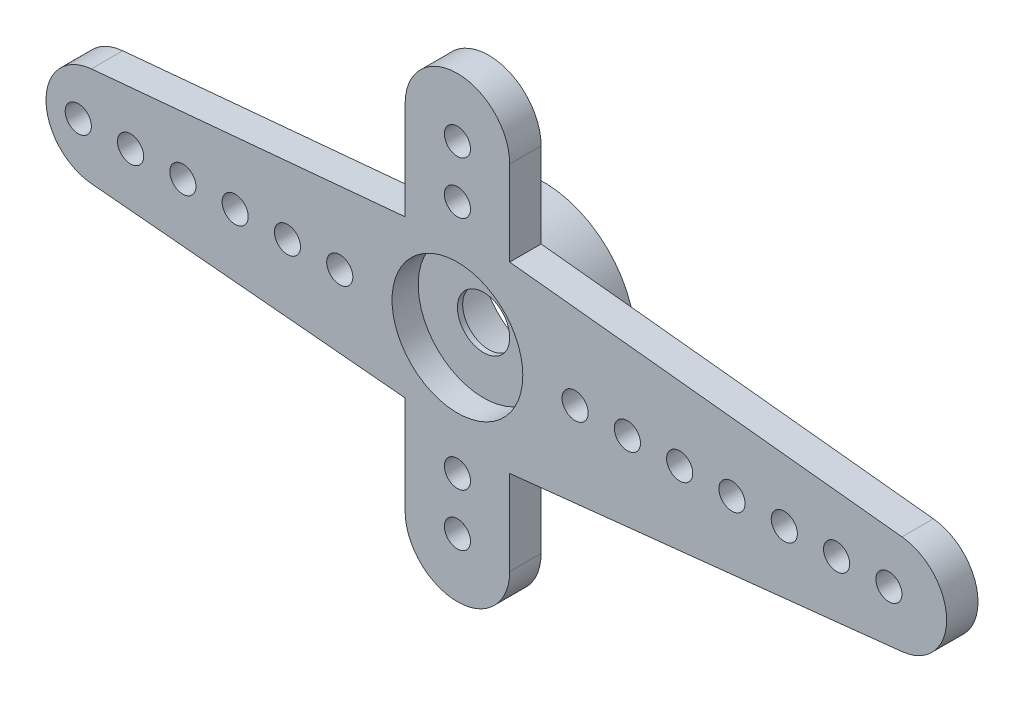
ISO-10303-21;
HEADER;
FILE_DESCRIPTION(('STEP AP214'),'2;1');
FILE_NAME('part.step','',(''),(''),'','','');
FILE_SCHEMA(('AUTOMOTIVE_DESIGN { 1 0 10303 214 1 1 1 1 }'));
ENDSEC;
DATA;
#1=APPLICATION_CONTEXT('core data for automotive mechanical design processes');
#2=APPLICATION_PROTOCOL_DEFINITION('international standard','automotive_design',2000,#1);
#3=PRODUCT_CONTEXT('',#1,'mechanical');
#4=PRODUCT('Part','Part','',(#3));
#5=PRODUCT_RELATED_PRODUCT_CATEGORY('part','',(#4));
#6=PRODUCT_DEFINITION_FORMATION('','',#4);
#7=PRODUCT_DEFINITION_CONTEXT('part definition',#1,'design');
#8=PRODUCT_DEFINITION('design','',#6,#7);
#9=PRODUCT_DEFINITION_SHAPE('','',#8);
#10=(LENGTH_UNIT() NAMED_UNIT(*) SI_UNIT(.MILLI.,.METRE.));
#11=(NAMED_UNIT(*) PLANE_ANGLE_UNIT() SI_UNIT($,.RADIAN.));
#12=(NAMED_UNIT(*) SI_UNIT($,.STERADIAN.) SOLID_ANGLE_UNIT());
#13=UNCERTAINTY_MEASURE_WITH_UNIT(LENGTH_MEASURE(1.E-05),#10,'distance_accuracy_value','');
#14=(GEOMETRIC_REPRESENTATION_CONTEXT(3) GLOBAL_UNCERTAINTY_ASSIGNED_CONTEXT((#13)) GLOBAL_UNIT_ASSIGNED_CONTEXT((#10,
#11,#12)) REPRESENTATION_CONTEXT('',''));
#15=CARTESIAN_POINT('',(0.,0.,0.));
#16=DIRECTION('',(0.,0.,1.));
#17=DIRECTION('',(1.,0.,0.));
#18=AXIS2_PLACEMENT_3D('',#15,#16,#17);
#19=CARTESIAN_POINT('',(0.,0.,-2.1));
#20=DIRECTION('',(0.,0.,1.));
#21=DIRECTION('',(1.,0.,0.));
#22=AXIS2_PLACEMENT_3D('',#19,#20,#21);
#23=CYLINDRICAL_SURFACE('',#22,1.);
#24=CARTESIAN_POINT('',(0.,0.,0.2));
#25=DIRECTION('',(0.,0.,1.));
#26=DIRECTION('',(1.,0.,0.));
#27=AXIS2_PLACEMENT_3D('',#24,#25,#26);
#28=CIRCLE('',#27,1.);
#29=CARTESIAN_POINT('',(1.,0.,0.2));
#30=VERTEX_POINT('',#29);
#31=EDGE_CURVE('E212',#30,#30,#28,.T.);
#32=ORIENTED_EDGE('',*,*,#31,.T.);
#33=EDGE_LOOP('',(#32));
#34=FACE_BOUND('',#33,.T.);
#35=CARTESIAN_POINT('',(0.,0.,0.));
#36=DIRECTION('',(0.,0.,-1.));
#37=DIRECTION('',(-1.,0.,0.));
#38=AXIS2_PLACEMENT_3D('',#35,#36,#37);
#39=CIRCLE('',#38,1.);
#40=CARTESIAN_POINT('',(-1.,0.,0.));
#41=VERTEX_POINT('',#40);
#42=EDGE_CURVE('E209',#41,#41,#39,.F.);
#43=ORIENTED_EDGE('',*,*,#42,.F.);
#44=EDGE_LOOP('',(#43));
#45=FACE_BOUND('',#44,.T.);
#46=ADVANCED_FACE('F36',(#34,#45),#23,.F.);
#47=CARTESIAN_POINT('',(0.,6.75,1.2));
#48=DIRECTION('',(0.,0.,-1.));
#49=DIRECTION('',(-1.,0.,0.));
#50=AXIS2_PLACEMENT_3D('',#47,#48,#49);
#51=CYLINDRICAL_SURFACE('',#50,2.);
#52=CARTESIAN_POINT('',(0.,6.75,0.));
#53=DIRECTION('',(0.,0.,1.));
#54=DIRECTION('',(-1.,0.,0.));
#55=AXIS2_PLACEMENT_3D('',#52,#53,#54);
#56=CIRCLE('',#55,2.);
#57=CARTESIAN_POINT('',(2.,6.75,0.));
#58=VERTEX_POINT('',#57);
#59=CARTESIAN_POINT('',(-2.,6.75,0.));
#60=VERTEX_POINT('',#59);
#61=EDGE_CURVE('E160',#58,#60,#56,.T.);
#62=ORIENTED_EDGE('',*,*,#61,.T.);
#63=DIRECTION('',(0.,0.,-1.));
#64=VECTOR('',#63,1.);
#65=CARTESIAN_POINT('',(-2.,6.75,1.2));
#66=LINE('',#65,#64);
#67=CARTESIAN_POINT('',(-2.,6.75,1.2));
#68=VERTEX_POINT('',#67);
#69=EDGE_CURVE('E46',#68,#60,#66,.T.);
#70=ORIENTED_EDGE('',*,*,#69,.F.);
#71=CARTESIAN_POINT('',(0.,6.75,1.2));
#72=DIRECTION('',(0.,0.,1.));
#73=DIRECTION('',(-1.,0.,0.));
#74=AXIS2_PLACEMENT_3D('',#71,#72,#73);
#75=CIRCLE('',#74,2.);
#76=CARTESIAN_POINT('',(2.,6.75,1.2));
#77=VERTEX_POINT('',#76);
#78=EDGE_CURVE('E183',#77,#68,#75,.T.);
#79=ORIENTED_EDGE('',*,*,#78,.F.);
#80=DIRECTION('',(0.,0.,-1.));
#81=VECTOR('',#80,1.);
#82=CARTESIAN_POINT('',(2.,6.75,1.2));
#83=LINE('',#82,#81);
#84=EDGE_CURVE('E156',#77,#58,#83,.T.);
#85=ORIENTED_EDGE('',*,*,#84,.T.);
#86=EDGE_LOOP('',(#62,#70,#79,#85));
#87=FACE_BOUND('',#86,.T.);
#88=ADVANCED_FACE('F38',(#87),#51,.T.);
#89=CARTESIAN_POINT('',(-2.,3.,1.2));
#90=DIRECTION('',(1.,0.,0.));
#91=DIRECTION('',(0.,0.,-1.));
#92=AXIS2_PLACEMENT_3D('',#89,#90,#91);
#93=PLANE('',#92);
#94=DIRECTION('',(0.,-1.,0.));
#95=VECTOR('',#94,1.);
#96=CARTESIAN_POINT('',(-2.,3.,0.));
#97=LINE('',#96,#95);
#98=CARTESIAN_POINT('',(-2.,3.,0.));
#99=VERTEX_POINT('',#98);
#100=EDGE_CURVE('E163',#60,#99,#97,.T.);
#101=ORIENTED_EDGE('',*,*,#100,.T.);
#102=DIRECTION('',(0.,0.,-1.));
#103=VECTOR('',#102,1.);
#104=CARTESIAN_POINT('',(-2.,3.,1.2));
#105=LINE('',#104,#103);
#106=CARTESIAN_POINT('',(-2.,3.,1.2));
#107=VERTEX_POINT('',#106);
#108=EDGE_CURVE('E205',#107,#99,#105,.T.);
#109=ORIENTED_EDGE('',*,*,#108,.F.);
#110=DIRECTION('',(0.,-1.,0.));
#111=VECTOR('',#110,1.);
#112=CARTESIAN_POINT('',(-2.,3.,1.2));
#113=LINE('',#112,#111);
#114=EDGE_CURVE('E111',#68,#107,#113,.T.);
#115=ORIENTED_EDGE('',*,*,#114,.F.);
#116=ORIENTED_EDGE('',*,*,#69,.T.);
#117=EDGE_LOOP('',(#101,#109,#115,#116));
#118=FACE_BOUND('',#117,.T.);
#119=ADVANCED_FACE('F342',(#118),#93,.F.);
#120=CARTESIAN_POINT('',(-14.,1.9,1.2));
#121=DIRECTION('',(0.0912839495849539,-0.995824904563132,0.));
#122=DIRECTION('',(0.995824904563132,0.0912839495849539,0.));
#123=AXIS2_PLACEMENT_3D('',#120,#121,#122);
#124=PLANE('',#123);
#125=DIRECTION('',(-0.995824904563132,-0.0912839495849539,0.));
#126=VECTOR('',#125,1.);
#127=CARTESIAN_POINT('',(-14.,1.9,0.));
#128=LINE('',#127,#126);
#129=CARTESIAN_POINT('',(-14.,1.9,0.));
#130=VERTEX_POINT('',#129);
#131=EDGE_CURVE('E166',#99,#130,#128,.T.);
#132=ORIENTED_EDGE('',*,*,#131,.T.);
#133=DIRECTION('',(0.,0.,-1.));
#134=VECTOR('',#133,1.);
#135=CARTESIAN_POINT('',(-14.,1.9,1.2));
#136=LINE('',#135,#134);
#137=CARTESIAN_POINT('',(-14.,1.9,1.2));
#138=VERTEX_POINT('',#137);
#139=EDGE_CURVE('E202',#138,#130,#136,.T.);
#140=ORIENTED_EDGE('',*,*,#139,.F.);
#141=DIRECTION('',(-0.995824904563132,-0.0912839495849539,0.));
#142=VECTOR('',#141,1.);
#143=CARTESIAN_POINT('',(-14.,1.9,1.2));
#144=LINE('',#143,#142);
#145=EDGE_CURVE('E297',#107,#138,#144,.T.);
#146=ORIENTED_EDGE('',*,*,#145,.F.);
#147=ORIENTED_EDGE('',*,*,#108,.T.);
#148=EDGE_LOOP('',(#132,#140,#146,#147));
#149=FACE_BOUND('',#148,.T.);
#150=ADVANCED_FACE('F791',(#149),#124,.F.);
#151=CARTESIAN_POINT('',(-13.8258333333333,0.,1.2));
#152=DIRECTION('',(0.,0.,-1.));
#153=DIRECTION('',(-1.,0.,0.));
#154=AXIS2_PLACEMENT_3D('',#151,#152,#153);
#155=CYLINDRICAL_SURFACE('',#154,1.90796593988933);
#156=CARTESIAN_POINT('',(-13.8258333333333,0.,0.));
#157=DIRECTION('',(0.,0.,1.));
#158=DIRECTION('',(1.,0.,0.));
#159=AXIS2_PLACEMENT_3D('',#156,#157,#158);
#160=CIRCLE('',#159,1.90796593988933);
#161=CARTESIAN_POINT('',(-14.,-1.9,0.));
#162=VERTEX_POINT('',#161);
#163=EDGE_CURVE('E168',#130,#162,#160,.T.);
#164=ORIENTED_EDGE('',*,*,#163,.T.);
#165=DIRECTION('',(0.,0.,-1.));
#166=VECTOR('',#165,1.);
#167=CARTESIAN_POINT('',(-14.,-1.9,1.2));
#168=LINE('',#167,#166);
#169=CARTESIAN_POINT('',(-14.,-1.9,1.2));
#170=VERTEX_POINT('',#169);
#171=EDGE_CURVE('E199',#170,#162,#168,.T.);
#172=ORIENTED_EDGE('',*,*,#171,.F.);
#173=CARTESIAN_POINT('',(-13.8258333333333,0.,1.2));
#174=DIRECTION('',(0.,0.,1.));
#175=DIRECTION('',(1.,0.,0.));
#176=AXIS2_PLACEMENT_3D('',#173,#174,#175);
#177=CIRCLE('',#176,1.90796593988933);
#178=EDGE_CURVE('E299',#138,#170,#177,.T.);
#179=ORIENTED_EDGE('',*,*,#178,.F.);
#180=ORIENTED_EDGE('',*,*,#139,.T.);
#181=EDGE_LOOP('',(#164,#172,#179,#180));
#182=FACE_BOUND('',#181,.T.);
#183=ADVANCED_FACE('F781',(#182),#155,.T.);
#184=CARTESIAN_POINT('',(-14.,-1.9,1.2));
#185=DIRECTION('',(0.0912839495849537,0.995824904563132,0.));
#186=DIRECTION('',(-0.995824904563133,0.0912839495849537,0.));
#187=AXIS2_PLACEMENT_3D('',#184,#185,#186);
#188=PLANE('',#187);
#189=DIRECTION('',(0.995824904563132,-0.0912839495849537,0.));
#190=VECTOR('',#189,1.);
#191=CARTESIAN_POINT('',(-14.,-1.9,0.));
#192=LINE('',#191,#190);
#193=CARTESIAN_POINT('',(-2.,-3.,0.));
#194=VERTEX_POINT('',#193);
#195=EDGE_CURVE('E170',#162,#194,#192,.T.);
#196=ORIENTED_EDGE('',*,*,#195,.T.);
#197=DIRECTION('',(0.,0.,-1.));
#198=VECTOR('',#197,1.);
#199=CARTESIAN_POINT('',(-2.,-3.,1.2));
#200=LINE('',#199,#198);
#201=CARTESIAN_POINT('',(-2.,-3.,1.2));
#202=VERTEX_POINT('',#201);
#203=EDGE_CURVE('E196',#202,#194,#200,.T.);
#204=ORIENTED_EDGE('',*,*,#203,.F.);
#205=DIRECTION('',(0.995824904563132,-0.0912839495849537,0.));
#206=VECTOR('',#205,1.);
#207=CARTESIAN_POINT('',(-14.,-1.9,1.2));
#208=LINE('',#207,#206);
#209=EDGE_CURVE('E301',#170,#202,#208,.T.);
#210=ORIENTED_EDGE('',*,*,#209,.F.);
#211=ORIENTED_EDGE('',*,*,#171,.T.);
#212=EDGE_LOOP('',(#196,#204,#210,#211));
#213=FACE_BOUND('',#212,.T.);
#214=ADVANCED_FACE('F771',(#213),#188,.F.);
#215=CARTESIAN_POINT('',(-2.,-6.75,1.2));
#216=DIRECTION('',(1.,0.,0.));
#217=DIRECTION('',(0.,0.,-1.));
#218=AXIS2_PLACEMENT_3D('',#215,#216,#217);
#219=PLANE('',#218);
#220=DIRECTION('',(0.,-1.,0.));
#221=VECTOR('',#220,1.);
#222=CARTESIAN_POINT('',(-2.,-6.75,0.));
#223=LINE('',#222,#221);
#224=CARTESIAN_POINT('',(-2.,-6.75,0.));
#225=VERTEX_POINT('',#224);
#226=EDGE_CURVE('E172',#194,#225,#223,.T.);
#227=ORIENTED_EDGE('',*,*,#226,.T.);
#228=DIRECTION('',(0.,0.,-1.));
#229=VECTOR('',#228,1.);
#230=CARTESIAN_POINT('',(-2.,-6.75,1.2));
#231=LINE('',#230,#229);
#232=CARTESIAN_POINT('',(-2.,-6.75,1.2));
#233=VERTEX_POINT('',#232);
#234=EDGE_CURVE('E193',#233,#225,#231,.T.);
#235=ORIENTED_EDGE('',*,*,#234,.F.);
#236=DIRECTION('',(0.,-1.,0.));
#237=VECTOR('',#236,1.);
#238=CARTESIAN_POINT('',(-2.,-6.75,1.2));
#239=LINE('',#238,#237);
#240=EDGE_CURVE('E303',#202,#233,#239,.T.);
#241=ORIENTED_EDGE('',*,*,#240,.F.);
#242=ORIENTED_EDGE('',*,*,#203,.T.);
#243=EDGE_LOOP('',(#227,#235,#241,#242));
#244=FACE_BOUND('',#243,.T.);
#245=ADVANCED_FACE('F761',(#244),#219,.F.);
#246=CARTESIAN_POINT('',(0.,-6.75,1.2));
#247=DIRECTION('',(0.,0.,-1.));
#248=DIRECTION('',(-1.,0.,0.));
#249=AXIS2_PLACEMENT_3D('',#246,#247,#248);
#250=CYLINDRICAL_SURFACE('',#249,2.);
#251=CARTESIAN_POINT('',(0.,-6.75,0.));
#252=DIRECTION('',(0.,0.,1.));
#253=DIRECTION('',(-1.,0.,0.));
#254=AXIS2_PLACEMENT_3D('',#251,#252,#253);
#255=CIRCLE('',#254,2.);
#256=CARTESIAN_POINT('',(2.,-6.75,0.));
#257=VERTEX_POINT('',#256);
#258=EDGE_CURVE('E174',#225,#257,#255,.T.);
#259=ORIENTED_EDGE('',*,*,#258,.T.);
#260=DIRECTION('',(0.,0.,-1.));
#261=VECTOR('',#260,1.);
#262=CARTESIAN_POINT('',(2.,-6.75,1.2));
#263=LINE('',#262,#261);
#264=CARTESIAN_POINT('',(2.,-6.75,1.2));
#265=VERTEX_POINT('',#264);
#266=EDGE_CURVE('E190',#265,#257,#263,.T.);
#267=ORIENTED_EDGE('',*,*,#266,.F.);
#268=CARTESIAN_POINT('',(0.,-6.75,1.2));
#269=DIRECTION('',(0.,0.,1.));
#270=DIRECTION('',(-1.,0.,0.));
#271=AXIS2_PLACEMENT_3D('',#268,#269,#270);
#272=CIRCLE('',#271,2.);
#273=EDGE_CURVE('E305',#233,#265,#272,.T.);
#274=ORIENTED_EDGE('',*,*,#273,.F.);
#275=ORIENTED_EDGE('',*,*,#234,.T.);
#276=EDGE_LOOP('',(#259,#267,#274,#275));
#277=FACE_BOUND('',#276,.T.);
#278=ADVANCED_FACE('F752',(#277),#250,.T.);
#279=CARTESIAN_POINT('',(2.,-6.75,1.2));
#280=DIRECTION('',(-1.,0.,0.));
#281=DIRECTION('',(0.,0.,1.));
#282=AXIS2_PLACEMENT_3D('',#279,#280,#281);
#283=PLANE('',#282);
#284=DIRECTION('',(0.,1.,0.));
#285=VECTOR('',#284,1.);
#286=CARTESIAN_POINT('',(2.,-6.75,0.));
#287=LINE('',#286,#285);
#288=CARTESIAN_POINT('',(2.,-3.5,0.));
#289=VERTEX_POINT('',#288);
#290=EDGE_CURVE('E176',#257,#289,#287,.T.);
#291=ORIENTED_EDGE('',*,*,#290,.T.);
#292=DIRECTION('',(0.,0.,-1.));
#293=VECTOR('',#292,1.);
#294=CARTESIAN_POINT('',(2.,-3.5,1.2));
#295=LINE('',#294,#293);
#296=CARTESIAN_POINT('',(2.,-3.5,1.2));
#297=VERTEX_POINT('',#296);
#298=EDGE_CURVE('E187',#297,#289,#295,.T.);
#299=ORIENTED_EDGE('',*,*,#298,.F.);
#300=DIRECTION('',(0.,1.,0.));
#301=VECTOR('',#300,1.);
#302=CARTESIAN_POINT('',(2.,-6.75,1.2));
#303=LINE('',#302,#301);
#304=EDGE_CURVE('E307',#265,#297,#303,.T.);
#305=ORIENTED_EDGE('',*,*,#304,.F.);
#306=ORIENTED_EDGE('',*,*,#266,.T.);
#307=EDGE_LOOP('',(#291,#299,#305,#306));
#308=FACE_BOUND('',#307,.T.);
#309=ADVANCED_FACE('F313',(#308),#283,.F.);
#310=CARTESIAN_POINT('',(17.,-1.9,1.2));
#311=DIRECTION('',(-0.106064981392206,0.994359200551929,0.));
#312=DIRECTION('',(-0.994359200551929,-0.106064981392206,0.));
#313=AXIS2_PLACEMENT_3D('',#310,#311,#312);
#314=PLANE('',#313);
#315=DIRECTION('',(0.994359200551929,0.106064981392206,0.));
#316=VECTOR('',#315,1.);
#317=CARTESIAN_POINT('',(17.,-1.9,0.));
#318=LINE('',#317,#316);
#319=CARTESIAN_POINT('',(17.,-1.9,0.));
#320=VERTEX_POINT('',#319);
#321=EDGE_CURVE('E178',#289,#320,#318,.T.);
#322=ORIENTED_EDGE('',*,*,#321,.T.);
#323=DIRECTION('',(0.,0.,-1.));
#324=VECTOR('',#323,1.);
#325=CARTESIAN_POINT('',(17.,-1.9,1.2));
#326=LINE('',#325,#324);
#327=CARTESIAN_POINT('',(17.,-1.9,1.2));
#328=VERTEX_POINT('',#327);
#329=EDGE_CURVE('E151',#328,#320,#326,.T.);
#330=ORIENTED_EDGE('',*,*,#329,.F.);
#331=DIRECTION('',(0.994359200551929,0.106064981392206,0.));
#332=VECTOR('',#331,1.);
#333=CARTESIAN_POINT('',(17.,-1.9,1.2));
#334=LINE('',#333,#332);
#335=EDGE_CURVE('E142',#297,#328,#334,.T.);
#336=ORIENTED_EDGE('',*,*,#335,.F.);
#337=ORIENTED_EDGE('',*,*,#298,.T.);
#338=EDGE_LOOP('',(#322,#330,#336,#337));
#339=FACE_BOUND('',#338,.T.);
#340=ADVANCED_FACE('F317',(#339),#314,.F.);
#341=CARTESIAN_POINT('',(16.7973333333333,0.,1.2));
#342=DIRECTION('',(0.,0.,-1.));
#343=DIRECTION('',(-1.,0.,0.));
#344=AXIS2_PLACEMENT_3D('',#341,#342,#343);
#345=CYLINDRICAL_SURFACE('',#344,1.91077831727749);
#346=CARTESIAN_POINT('',(16.7973333333333,0.,0.));
#347=DIRECTION('',(0.,0.,1.));
#348=DIRECTION('',(1.,0.,0.));
#349=AXIS2_PLACEMENT_3D('',#346,#347,#348);
#350=CIRCLE('',#349,1.91077831727749);
#351=CARTESIAN_POINT('',(17.,1.9,0.));
#352=VERTEX_POINT('',#351);
#353=EDGE_CURVE('E150',#320,#352,#350,.T.);
#354=ORIENTED_EDGE('',*,*,#353,.T.);
#355=DIRECTION('',(0.,0.,-1.));
#356=VECTOR('',#355,1.);
#357=CARTESIAN_POINT('',(17.,1.9,1.2));
#358=LINE('',#357,#356);
#359=CARTESIAN_POINT('',(17.,1.9,1.2));
#360=VERTEX_POINT('',#359);
#361=EDGE_CURVE('E147',#360,#352,#358,.T.);
#362=ORIENTED_EDGE('',*,*,#361,.F.);
#363=CARTESIAN_POINT('',(16.7973333333333,0.,1.2));
#364=DIRECTION('',(0.,0.,1.));
#365=DIRECTION('',(1.,0.,0.));
#366=AXIS2_PLACEMENT_3D('',#363,#364,#365);
#367=CIRCLE('',#366,1.91077831727749);
#368=EDGE_CURVE('E136',#328,#360,#367,.T.);
#369=ORIENTED_EDGE('',*,*,#368,.F.);
#370=ORIENTED_EDGE('',*,*,#329,.T.);
#371=EDGE_LOOP('',(#354,#362,#369,#370));
#372=FACE_BOUND('',#371,.T.);
#373=ADVANCED_FACE('F148',(#372),#345,.T.);
#374=CARTESIAN_POINT('',(2.,3.5,1.2));
#375=DIRECTION('',(-0.106064981392206,-0.994359200551929,0.));
#376=DIRECTION('',(0.994359200551929,-0.106064981392206,0.));
#377=AXIS2_PLACEMENT_3D('',#374,#375,#376);
#378=PLANE('',#377);
#379=DIRECTION('',(-0.994359200551929,0.106064981392206,0.));
#380=VECTOR('',#379,1.);
#381=CARTESIAN_POINT('',(2.,3.5,0.));
#382=LINE('',#381,#380);
#383=CARTESIAN_POINT('',(2.,3.5,0.));
#384=VERTEX_POINT('',#383);
#385=EDGE_CURVE('E96',#352,#384,#382,.T.);
#386=ORIENTED_EDGE('',*,*,#385,.T.);
#387=DIRECTION('',(0.,0.,-1.));
#388=VECTOR('',#387,1.);
#389=CARTESIAN_POINT('',(2.,3.5,1.2));
#390=LINE('',#389,#388);
#391=CARTESIAN_POINT('',(2.,3.5,1.2));
#392=VERTEX_POINT('',#391);
#393=EDGE_CURVE('E152',#392,#384,#390,.T.);
#394=ORIENTED_EDGE('',*,*,#393,.F.);
#395=DIRECTION('',(-0.994359200551929,0.106064981392206,0.));
#396=VECTOR('',#395,1.);
#397=CARTESIAN_POINT('',(2.,3.5,1.2));
#398=LINE('',#397,#396);
#399=EDGE_CURVE('E140',#360,#392,#398,.T.);
#400=ORIENTED_EDGE('',*,*,#399,.F.);
#401=ORIENTED_EDGE('',*,*,#361,.T.);
#402=EDGE_LOOP('',(#386,#394,#400,#401));
#403=FACE_BOUND('',#402,.T.);
#404=ADVANCED_FACE('F154',(#403),#378,.F.);
#405=CARTESIAN_POINT('',(2.,3.5,1.2));
#406=DIRECTION('',(-1.,0.,0.));
#407=DIRECTION('',(0.,0.,1.));
#408=AXIS2_PLACEMENT_3D('',#405,#406,#407);
#409=PLANE('',#408);
#410=DIRECTION('',(0.,1.,0.));
#411=VECTOR('',#410,1.);
#412=CARTESIAN_POINT('',(2.,3.5,0.));
#413=LINE('',#412,#411);
#414=EDGE_CURVE('E102',#384,#58,#413,.T.);
#415=ORIENTED_EDGE('',*,*,#414,.T.);
#416=ORIENTED_EDGE('',*,*,#84,.F.);
#417=DIRECTION('',(0.,1.,0.));
#418=VECTOR('',#417,1.);
#419=CARTESIAN_POINT('',(2.,3.5,1.2));
#420=LINE('',#419,#418);
#421=EDGE_CURVE('E55',#392,#77,#420,.T.);
#422=ORIENTED_EDGE('',*,*,#421,.F.);
#423=ORIENTED_EDGE('',*,*,#393,.T.);
#424=EDGE_LOOP('',(#415,#416,#422,#423));
#425=FACE_BOUND('',#424,.T.);
#426=ADVANCED_FACE('F325',(#425),#409,.F.);
#427=CARTESIAN_POINT('',(0.,6.75,1.2));
#428=DIRECTION('',(0.,0.,-1.));
#429=DIRECTION('',(-1.,0.,0.));
#430=AXIS2_PLACEMENT_3D('',#427,#428,#429);
#431=PLANE('',#430);
#432=CARTESIAN_POINT('',(16.5,0.,1.2));
#433=DIRECTION('',(0.,0.,1.));
#434=DIRECTION('',(1.,0.,0.));
#435=AXIS2_PLACEMENT_3D('',#432,#433,#434);
#436=CIRCLE('',#435,0.499999999999999);
#437=CARTESIAN_POINT('',(17.,0.,1.2));
#438=VERTEX_POINT('',#437);
#439=EDGE_CURVE('E615',#438,#438,#436,.T.);
#440=ORIENTED_EDGE('',*,*,#439,.F.);
#441=EDGE_LOOP('',(#440));
#442=FACE_BOUND('',#441,.T.);
#443=CARTESIAN_POINT('',(14.5,0.,1.2));
#444=DIRECTION('',(0.,0.,1.));
#445=DIRECTION('',(-1.,0.,0.));
#446=AXIS2_PLACEMENT_3D('',#443,#444,#445);
#447=CIRCLE('',#446,0.500000000000001);
#448=CARTESIAN_POINT('',(14.,0.,1.2));
#449=VERTEX_POINT('',#448);
#450=EDGE_CURVE('E616',#449,#449,#447,.T.);
#451=ORIENTED_EDGE('',*,*,#450,.F.);
#452=EDGE_LOOP('',(#451));
#453=FACE_BOUND('',#452,.T.);
#454=CARTESIAN_POINT('',(12.5,0.,1.2));
#455=DIRECTION('',(0.,0.,1.));
#456=DIRECTION('',(-1.,0.,0.));
#457=AXIS2_PLACEMENT_3D('',#454,#455,#456);
#458=CIRCLE('',#457,0.500000000000001);
#459=CARTESIAN_POINT('',(12.,0.,1.2));
#460=VERTEX_POINT('',#459);
#461=EDGE_CURVE('E619',#460,#460,#458,.T.);
#462=ORIENTED_EDGE('',*,*,#461,.F.);
#463=EDGE_LOOP('',(#462));
#464=FACE_BOUND('',#463,.T.);
#465=CARTESIAN_POINT('',(10.5,0.,1.2));
#466=DIRECTION('',(0.,0.,1.));
#467=DIRECTION('',(-1.,0.,0.));
#468=AXIS2_PLACEMENT_3D('',#465,#466,#467);
#469=CIRCLE('',#468,0.500000000000001);
#470=CARTESIAN_POINT('',(10.,0.,1.2));
#471=VERTEX_POINT('',#470);
#472=EDGE_CURVE('E649',#471,#471,#469,.T.);
#473=ORIENTED_EDGE('',*,*,#472,.F.);
#474=EDGE_LOOP('',(#473));
#475=FACE_BOUND('',#474,.T.);
#476=CARTESIAN_POINT('',(-6.5,0.,1.2));
#477=DIRECTION('',(0.,0.,1.));
#478=DIRECTION('',(1.,0.,0.));
#479=AXIS2_PLACEMENT_3D('',#476,#477,#478);
#480=CIRCLE('',#479,0.5);
#481=CARTESIAN_POINT('',(-6.,0.,1.2));
#482=VERTEX_POINT('',#481);
#483=EDGE_CURVE('E624',#482,#482,#480,.T.);
#484=ORIENTED_EDGE('',*,*,#483,.F.);
#485=EDGE_LOOP('',(#484));
#486=FACE_BOUND('',#485,.T.);
#487=CARTESIAN_POINT('',(-8.5,0.,1.2));
#488=DIRECTION('',(0.,0.,1.));
#489=DIRECTION('',(1.,0.,0.));
#490=AXIS2_PLACEMENT_3D('',#487,#488,#489);
#491=CIRCLE('',#490,0.500000000000001);
#492=CARTESIAN_POINT('',(-8.,0.,1.2));
#493=VERTEX_POINT('',#492);
#494=EDGE_CURVE('E632',#493,#493,#491,.T.);
#495=ORIENTED_EDGE('',*,*,#494,.F.);
#496=EDGE_LOOP('',(#495));
#497=FACE_BOUND('',#496,.T.);
#498=CARTESIAN_POINT('',(-10.5,0.,1.2));
#499=DIRECTION('',(0.,0.,1.));
#500=DIRECTION('',(1.,0.,0.));
#501=AXIS2_PLACEMENT_3D('',#498,#499,#500);
#502=CIRCLE('',#501,0.500000000000001);
#503=CARTESIAN_POINT('',(-10.,0.,1.2));
#504=VERTEX_POINT('',#503);
#505=EDGE_CURVE('E637',#504,#504,#502,.T.);
#506=ORIENTED_EDGE('',*,*,#505,.F.);
#507=EDGE_LOOP('',(#506));
#508=FACE_BOUND('',#507,.T.);
#509=CARTESIAN_POINT('',(-12.5,0.,1.2));
#510=DIRECTION('',(0.,0.,1.));
#511=DIRECTION('',(1.,0.,0.));
#512=AXIS2_PLACEMENT_3D('',#509,#510,#511);
#513=CIRCLE('',#512,0.500000000000001);
#514=CARTESIAN_POINT('',(-12.,0.,1.2));
#515=VERTEX_POINT('',#514);
#516=EDGE_CURVE('E645',#515,#515,#513,.T.);
#517=ORIENTED_EDGE('',*,*,#516,.F.);
#518=EDGE_LOOP('',(#517));
#519=FACE_BOUND('',#518,.T.);
#520=CARTESIAN_POINT('',(-14.5,0.,1.2));
#521=DIRECTION('',(0.,0.,1.));
#522=DIRECTION('',(1.,0.,0.));
#523=AXIS2_PLACEMENT_3D('',#520,#521,#522);
#524=CIRCLE('',#523,0.500000000000001);
#525=CARTESIAN_POINT('',(-14.,0.,1.2));
#526=VERTEX_POINT('',#525);
#527=EDGE_CURVE('E648',#526,#526,#524,.T.);
#528=ORIENTED_EDGE('',*,*,#527,.F.);
#529=EDGE_LOOP('',(#528));
#530=FACE_BOUND('',#529,.T.);
#531=CARTESIAN_POINT('',(4.5,0.,1.2));
#532=DIRECTION('',(0.,0.,1.));
#533=DIRECTION('',(-1.,0.,0.));
#534=AXIS2_PLACEMENT_3D('',#531,#532,#533);
#535=CIRCLE('',#534,0.5);
#536=CARTESIAN_POINT('',(4.,0.,1.2));
#537=VERTEX_POINT('',#536);
#538=EDGE_CURVE('E671',#537,#537,#535,.T.);
#539=ORIENTED_EDGE('',*,*,#538,.F.);
#540=EDGE_LOOP('',(#539));
#541=FACE_BOUND('',#540,.T.);
#542=CARTESIAN_POINT('',(6.5,0.,1.2));
#543=DIRECTION('',(0.,0.,1.));
#544=DIRECTION('',(-1.,0.,0.));
#545=AXIS2_PLACEMENT_3D('',#542,#543,#544);
#546=CIRCLE('',#545,0.5);
#547=CARTESIAN_POINT('',(6.,0.,1.2));
#548=VERTEX_POINT('',#547);
#549=EDGE_CURVE('E675',#548,#548,#546,.T.);
#550=ORIENTED_EDGE('',*,*,#549,.F.);
#551=EDGE_LOOP('',(#550));
#552=FACE_BOUND('',#551,.T.);
#553=CARTESIAN_POINT('',(8.5,0.,1.2));
#554=DIRECTION('',(0.,0.,1.));
#555=DIRECTION('',(-1.,0.,0.));
#556=AXIS2_PLACEMENT_3D('',#553,#554,#555);
#557=CIRCLE('',#556,0.500000000000001);
#558=CARTESIAN_POINT('',(8.,0.,1.2));
#559=VERTEX_POINT('',#558);
#560=EDGE_CURVE('E640',#559,#559,#557,.T.);
#561=ORIENTED_EDGE('',*,*,#560,.F.);
#562=EDGE_LOOP('',(#561));
#563=FACE_BOUND('',#562,.T.);
#564=CARTESIAN_POINT('',(-4.5,0.,1.2));
#565=DIRECTION('',(0.,0.,1.));
#566=DIRECTION('',(1.,0.,0.));
#567=AXIS2_PLACEMENT_3D('',#564,#565,#566);
#568=CIRCLE('',#567,0.5);
#569=CARTESIAN_POINT('',(-4.,0.,1.2));
#570=VERTEX_POINT('',#569);
#571=EDGE_CURVE('E232',#570,#570,#568,.T.);
#572=ORIENTED_EDGE('',*,*,#571,.F.);
#573=EDGE_LOOP('',(#572));
#574=FACE_BOUND('',#573,.T.);
#575=CARTESIAN_POINT('',(0.,6.5,1.2));
#576=DIRECTION('',(0.,0.,1.));
#577=DIRECTION('',(1.,0.,0.));
#578=AXIS2_PLACEMENT_3D('',#575,#576,#577);
#579=CIRCLE('',#578,0.5);
#580=CARTESIAN_POINT('',(0.5,6.5,1.2));
#581=VERTEX_POINT('',#580);
#582=EDGE_CURVE('E266',#581,#581,#579,.T.);
#583=ORIENTED_EDGE('',*,*,#582,.F.);
#584=EDGE_LOOP('',(#583));
#585=FACE_BOUND('',#584,.T.);
#586=CARTESIAN_POINT('',(0.,4.5,1.2));
#587=DIRECTION('',(0.,0.,1.));
#588=DIRECTION('',(1.,0.,0.));
#589=AXIS2_PLACEMENT_3D('',#586,#587,#588);
#590=CIRCLE('',#589,0.5);
#591=CARTESIAN_POINT('',(0.5,4.5,1.2));
#592=VERTEX_POINT('',#591);
#593=EDGE_CURVE('E270',#592,#592,#590,.T.);
#594=ORIENTED_EDGE('',*,*,#593,.F.);
#595=EDGE_LOOP('',(#594));
#596=FACE_BOUND('',#595,.T.);
#597=CARTESIAN_POINT('',(0.,-6.5,1.2));
#598=DIRECTION('',(0.,0.,1.));
#599=DIRECTION('',(1.,0.,0.));
#600=AXIS2_PLACEMENT_3D('',#597,#598,#599);
#601=CIRCLE('',#600,0.5);
#602=CARTESIAN_POINT('',(0.5,-6.5,1.2));
#603=VERTEX_POINT('',#602);
#604=EDGE_CURVE('E275',#603,#603,#601,.T.);
#605=ORIENTED_EDGE('',*,*,#604,.F.);
#606=EDGE_LOOP('',(#605));
#607=FACE_BOUND('',#606,.T.);
#608=CARTESIAN_POINT('',(0.,-4.5,1.2));
#609=DIRECTION('',(0.,0.,1.));
#610=DIRECTION('',(1.,0.,0.));
#611=AXIS2_PLACEMENT_3D('',#608,#609,#610);
#612=CIRCLE('',#611,0.5);
#613=CARTESIAN_POINT('',(0.5,-4.5,1.2));
#614=VERTEX_POINT('',#613);
#615=EDGE_CURVE('E218',#614,#614,#612,.T.);
#616=ORIENTED_EDGE('',*,*,#615,.F.);
#617=EDGE_LOOP('',(#616));
#618=FACE_BOUND('',#617,.T.);
#619=CARTESIAN_POINT('',(0.,0.,1.2));
#620=DIRECTION('',(0.,0.,1.));
#621=DIRECTION('',(1.,0.,0.));
#622=AXIS2_PLACEMENT_3D('',#619,#620,#621);
#623=CIRCLE('',#622,2.5);
#624=CARTESIAN_POINT('',(2.5,0.,1.2));
#625=VERTEX_POINT('',#624);
#626=EDGE_CURVE('E287',#625,#625,#623,.T.);
#627=ORIENTED_EDGE('',*,*,#626,.F.);
#628=EDGE_LOOP('',(#627));
#629=FACE_BOUND('',#628,.T.);
#630=ORIENTED_EDGE('',*,*,#78,.T.);
#631=ORIENTED_EDGE('',*,*,#114,.T.);
#632=ORIENTED_EDGE('',*,*,#145,.T.);
#633=ORIENTED_EDGE('',*,*,#178,.T.);
#634=ORIENTED_EDGE('',*,*,#209,.T.);
#635=ORIENTED_EDGE('',*,*,#240,.T.);
#636=ORIENTED_EDGE('',*,*,#273,.T.);
#637=ORIENTED_EDGE('',*,*,#304,.T.);
#638=ORIENTED_EDGE('',*,*,#335,.T.);
#639=ORIENTED_EDGE('',*,*,#368,.T.);
#640=ORIENTED_EDGE('',*,*,#399,.T.);
#641=ORIENTED_EDGE('',*,*,#421,.T.);
#642=EDGE_LOOP('',(#630,#631,#632,#633,#634,#635,#636,#637,#638,#639,#640,#641));
#643=FACE_BOUND('',#642,.T.);
#644=ADVANCED_FACE('F138',(#442,#453,#464,#475,#486,#497,#508,#519,#530,#541,#552,#563,#574,
#585,#596,#607,#618,#629,#643),#431,.F.);
#645=CARTESIAN_POINT('',(0.,6.75,0.));
#646=DIRECTION('',(0.,0.,-1.));
#647=DIRECTION('',(-1.,0.,0.));
#648=AXIS2_PLACEMENT_3D('',#645,#646,#647);
#649=PLANE('',#648);
#650=CARTESIAN_POINT('',(16.5,0.,0.));
#651=DIRECTION('',(0.,0.,-1.));
#652=DIRECTION('',(-1.,0.,0.));
#653=AXIS2_PLACEMENT_3D('',#650,#651,#652);
#654=CIRCLE('',#653,0.499999999999999);
#655=CARTESIAN_POINT('',(16.,0.,0.));
#656=VERTEX_POINT('',#655);
#657=EDGE_CURVE('E40',#656,#656,#654,.T.);
#658=ORIENTED_EDGE('',*,*,#657,.F.);
#659=EDGE_LOOP('',(#658));
#660=FACE_BOUND('',#659,.T.);
#661=CARTESIAN_POINT('',(14.5,0.,0.));
#662=DIRECTION('',(0.,0.,-1.));
#663=DIRECTION('',(-1.,0.,0.));
#664=AXIS2_PLACEMENT_3D('',#661,#662,#663);
#665=CIRCLE('',#664,0.500000000000001);
#666=CARTESIAN_POINT('',(14.,0.,0.));
#667=VERTEX_POINT('',#666);
#668=EDGE_CURVE('E261',#667,#667,#665,.T.);
#669=ORIENTED_EDGE('',*,*,#668,.F.);
#670=EDGE_LOOP('',(#669));
#671=FACE_BOUND('',#670,.T.);
#672=CARTESIAN_POINT('',(12.5,0.,0.));
#673=DIRECTION('',(0.,0.,-1.));
#674=DIRECTION('',(-1.,0.,0.));
#675=AXIS2_PLACEMENT_3D('',#672,#673,#674);
#676=CIRCLE('',#675,0.500000000000001);
#677=CARTESIAN_POINT('',(12.,0.,0.));
#678=VERTEX_POINT('',#677);
#679=EDGE_CURVE('E259',#678,#678,#676,.T.);
#680=ORIENTED_EDGE('',*,*,#679,.F.);
#681=EDGE_LOOP('',(#680));
#682=FACE_BOUND('',#681,.T.);
#683=CARTESIAN_POINT('',(10.5,0.,0.));
#684=DIRECTION('',(0.,0.,-1.));
#685=DIRECTION('',(-1.,0.,0.));
#686=AXIS2_PLACEMENT_3D('',#683,#684,#685);
#687=CIRCLE('',#686,0.500000000000001);
#688=CARTESIAN_POINT('',(10.,0.,0.));
#689=VERTEX_POINT('',#688);
#690=EDGE_CURVE('E256',#689,#689,#687,.T.);
#691=ORIENTED_EDGE('',*,*,#690,.F.);
#692=EDGE_LOOP('',(#691));
#693=FACE_BOUND('',#692,.T.);
#694=CARTESIAN_POINT('',(-6.5,0.,0.));
#695=DIRECTION('',(0.,0.,-1.));
#696=DIRECTION('',(-1.,0.,0.));
#697=AXIS2_PLACEMENT_3D('',#694,#695,#696);
#698=CIRCLE('',#697,0.5);
#699=CARTESIAN_POINT('',(-7.,0.,0.));
#700=VERTEX_POINT('',#699);
#701=EDGE_CURVE('E253',#700,#700,#698,.T.);
#702=ORIENTED_EDGE('',*,*,#701,.F.);
#703=EDGE_LOOP('',(#702));
#704=FACE_BOUND('',#703,.T.);
#705=CARTESIAN_POINT('',(-8.5,0.,0.));
#706=DIRECTION('',(0.,0.,-1.));
#707=DIRECTION('',(-1.,0.,0.));
#708=AXIS2_PLACEMENT_3D('',#705,#706,#707);
#709=CIRCLE('',#708,0.500000000000001);
#710=CARTESIAN_POINT('',(-9.,0.,0.));
#711=VERTEX_POINT('',#710);
#712=EDGE_CURVE('E250',#711,#711,#709,.T.);
#713=ORIENTED_EDGE('',*,*,#712,.F.);
#714=EDGE_LOOP('',(#713));
#715=FACE_BOUND('',#714,.T.);
#716=CARTESIAN_POINT('',(-10.5,0.,0.));
#717=DIRECTION('',(0.,0.,-1.));
#718=DIRECTION('',(-1.,0.,0.));
#719=AXIS2_PLACEMENT_3D('',#716,#717,#718);
#720=CIRCLE('',#719,0.500000000000001);
#721=CARTESIAN_POINT('',(-11.,0.,0.));
#722=VERTEX_POINT('',#721);
#723=EDGE_CURVE('E247',#722,#722,#720,.T.);
#724=ORIENTED_EDGE('',*,*,#723,.F.);
#725=EDGE_LOOP('',(#724));
#726=FACE_BOUND('',#725,.T.);
#727=CARTESIAN_POINT('',(-12.5,0.,0.));
#728=DIRECTION('',(0.,0.,-1.));
#729=DIRECTION('',(-1.,0.,0.));
#730=AXIS2_PLACEMENT_3D('',#727,#728,#729);
#731=CIRCLE('',#730,0.500000000000001);
#732=CARTESIAN_POINT('',(-13.,0.,0.));
#733=VERTEX_POINT('',#732);
#734=EDGE_CURVE('E244',#733,#733,#731,.T.);
#735=ORIENTED_EDGE('',*,*,#734,.F.);
#736=EDGE_LOOP('',(#735));
#737=FACE_BOUND('',#736,.T.);
#738=CARTESIAN_POINT('',(-14.5,0.,0.));
#739=DIRECTION('',(0.,0.,-1.));
#740=DIRECTION('',(-1.,0.,0.));
#741=AXIS2_PLACEMENT_3D('',#738,#739,#740);
#742=CIRCLE('',#741,0.500000000000001);
#743=CARTESIAN_POINT('',(-15.,0.,0.));
#744=VERTEX_POINT('',#743);
#745=EDGE_CURVE('E241',#744,#744,#742,.T.);
#746=ORIENTED_EDGE('',*,*,#745,.F.);
#747=EDGE_LOOP('',(#746));
#748=FACE_BOUND('',#747,.T.);
#749=CARTESIAN_POINT('',(4.5,0.,0.));
#750=DIRECTION('',(0.,0.,-1.));
#751=DIRECTION('',(-1.,0.,0.));
#752=AXIS2_PLACEMENT_3D('',#749,#750,#751);
#753=CIRCLE('',#752,0.5);
#754=CARTESIAN_POINT('',(4.,0.,0.));
#755=VERTEX_POINT('',#754);
#756=EDGE_CURVE('E238',#755,#755,#753,.T.);
#757=ORIENTED_EDGE('',*,*,#756,.F.);
#758=EDGE_LOOP('',(#757));
#759=FACE_BOUND('',#758,.T.);
#760=CARTESIAN_POINT('',(6.5,0.,0.));
#761=DIRECTION('',(0.,0.,-1.));
#762=DIRECTION('',(-1.,0.,0.));
#763=AXIS2_PLACEMENT_3D('',#760,#761,#762);
#764=CIRCLE('',#763,0.5);
#765=CARTESIAN_POINT('',(6.,0.,0.));
#766=VERTEX_POINT('',#765);
#767=EDGE_CURVE('E235',#766,#766,#764,.T.);
#768=ORIENTED_EDGE('',*,*,#767,.F.);
#769=EDGE_LOOP('',(#768));
#770=FACE_BOUND('',#769,.T.);
#771=CARTESIAN_POINT('',(8.5,0.,0.));
#772=DIRECTION('',(0.,0.,-1.));
#773=DIRECTION('',(-1.,0.,0.));
#774=AXIS2_PLACEMENT_3D('',#771,#772,#773);
#775=CIRCLE('',#774,0.500000000000001);
#776=CARTESIAN_POINT('',(8.,0.,0.));
#777=VERTEX_POINT('',#776);
#778=EDGE_CURVE('E231',#777,#777,#775,.T.);
#779=ORIENTED_EDGE('',*,*,#778,.F.);
#780=EDGE_LOOP('',(#779));
#781=FACE_BOUND('',#780,.T.);
#782=CARTESIAN_POINT('',(-4.5,0.,0.));
#783=DIRECTION('',(0.,0.,-1.));
#784=DIRECTION('',(-1.,0.,0.));
#785=AXIS2_PLACEMENT_3D('',#782,#783,#784);
#786=CIRCLE('',#785,0.5);
#787=CARTESIAN_POINT('',(-5.,0.,0.));
#788=VERTEX_POINT('',#787);
#789=EDGE_CURVE('E228',#788,#788,#786,.T.);
#790=ORIENTED_EDGE('',*,*,#789,.F.);
#791=EDGE_LOOP('',(#790));
#792=FACE_BOUND('',#791,.T.);
#793=CARTESIAN_POINT('',(0.,6.5,0.));
#794=DIRECTION('',(0.,0.,-1.));
#795=DIRECTION('',(-1.,0.,0.));
#796=AXIS2_PLACEMENT_3D('',#793,#794,#795);
#797=CIRCLE('',#796,0.5);
#798=CARTESIAN_POINT('',(-0.5,6.5,0.));
#799=VERTEX_POINT('',#798);
#800=EDGE_CURVE('E224',#799,#799,#797,.T.);
#801=ORIENTED_EDGE('',*,*,#800,.F.);
#802=EDGE_LOOP('',(#801));
#803=FACE_BOUND('',#802,.T.);
#804=CARTESIAN_POINT('',(0.,4.5,0.));
#805=DIRECTION('',(0.,0.,-1.));
#806=DIRECTION('',(-1.,0.,0.));
#807=AXIS2_PLACEMENT_3D('',#804,#805,#806);
#808=CIRCLE('',#807,0.5);
#809=CARTESIAN_POINT('',(-0.5,4.5,0.));
#810=VERTEX_POINT('',#809);
#811=EDGE_CURVE('E221',#810,#810,#808,.T.);
#812=ORIENTED_EDGE('',*,*,#811,.F.);
#813=EDGE_LOOP('',(#812));
#814=FACE_BOUND('',#813,.T.);
#815=CARTESIAN_POINT('',(0.,-6.5,0.));
#816=DIRECTION('',(0.,0.,-1.));
#817=DIRECTION('',(-1.,0.,0.));
#818=AXIS2_PLACEMENT_3D('',#815,#816,#817);
#819=CIRCLE('',#818,0.5);
#820=CARTESIAN_POINT('',(-0.5,-6.5,0.));
#821=VERTEX_POINT('',#820);
#822=EDGE_CURVE('E217',#821,#821,#819,.T.);
#823=ORIENTED_EDGE('',*,*,#822,.F.);
#824=EDGE_LOOP('',(#823));
#825=FACE_BOUND('',#824,.T.);
#826=CARTESIAN_POINT('',(0.,-4.5,0.));
#827=DIRECTION('',(0.,0.,-1.));
#828=DIRECTION('',(-1.,0.,0.));
#829=AXIS2_PLACEMENT_3D('',#826,#827,#828);
#830=CIRCLE('',#829,0.5);
#831=CARTESIAN_POINT('',(-0.5,-4.5,0.));
#832=VERTEX_POINT('',#831);
#833=EDGE_CURVE('E214',#832,#832,#830,.T.);
#834=ORIENTED_EDGE('',*,*,#833,.F.);
#835=EDGE_LOOP('',(#834));
#836=FACE_BOUND('',#835,.T.);
#837=CARTESIAN_POINT('',(0.,0.,0.));
#838=DIRECTION('',(0.,0.,-1.));
#839=DIRECTION('',(-1.,0.,0.));
#840=AXIS2_PLACEMENT_3D('',#837,#838,#839);
#841=CIRCLE('',#840,3.5);
#842=CARTESIAN_POINT('',(-3.5,0.,0.));
#843=VERTEX_POINT('',#842);
#844=EDGE_CURVE('E11',#843,#843,#841,.T.);
#845=ORIENTED_EDGE('',*,*,#844,.F.);
#846=EDGE_LOOP('',(#845));
#847=FACE_BOUND('',#846,.T.);
#848=ORIENTED_EDGE('',*,*,#61,.F.);
#849=ORIENTED_EDGE('',*,*,#414,.F.);
#850=ORIENTED_EDGE('',*,*,#385,.F.);
#851=ORIENTED_EDGE('',*,*,#353,.F.);
#852=ORIENTED_EDGE('',*,*,#321,.F.);
#853=ORIENTED_EDGE('',*,*,#290,.F.);
#854=ORIENTED_EDGE('',*,*,#258,.F.);
#855=ORIENTED_EDGE('',*,*,#226,.F.);
#856=ORIENTED_EDGE('',*,*,#195,.F.);
#857=ORIENTED_EDGE('',*,*,#163,.F.);
#858=ORIENTED_EDGE('',*,*,#131,.F.);
#859=ORIENTED_EDGE('',*,*,#100,.F.);
#860=EDGE_LOOP('',(#848,#849,#850,#851,#852,#853,#854,#855,#856,#857,#858,#859));
#861=FACE_BOUND('',#860,.T.);
#862=ADVANCED_FACE('F320',(#660,#671,#682,#693,#704,#715,#726,#737,#748,#759,#770,#781,#792,
#803,#814,#825,#836,#847,#861),#649,.T.);
#863=CARTESIAN_POINT('',(0.,0.,-2.1));
#864=DIRECTION('',(0.,0.,1.));
#865=DIRECTION('',(1.,0.,0.));
#866=AXIS2_PLACEMENT_3D('',#863,#864,#865);
#867=CYLINDRICAL_SURFACE('',#866,3.5);
#868=CARTESIAN_POINT('',(0.,0.,-2.1));
#869=DIRECTION('',(0.,0.,-1.));
#870=DIRECTION('',(-1.,0.,0.));
#871=AXIS2_PLACEMENT_3D('',#868,#869,#870);
#872=CIRCLE('',#871,3.5);
#873=CARTESIAN_POINT('',(-3.5,0.,-2.1));
#874=VERTEX_POINT('',#873);
#875=EDGE_CURVE('E164',#874,#874,#872,.T.);
#876=ORIENTED_EDGE('',*,*,#875,.F.);
#877=EDGE_LOOP('',(#876));
#878=FACE_BOUND('',#877,.T.);
#879=ORIENTED_EDGE('',*,*,#844,.T.);
#880=EDGE_LOOP('',(#879));
#881=FACE_BOUND('',#880,.T.);
#882=ADVANCED_FACE('F360',(#878,#881),#867,.T.);
#883=CARTESIAN_POINT('',(0.,0.,-2.1));
#884=DIRECTION('',(0.,0.,-1.));
#885=DIRECTION('',(-1.,0.,0.));
#886=AXIS2_PLACEMENT_3D('',#883,#884,#885);
#887=PLANE('',#886);
#888=CARTESIAN_POINT('',(0.,0.,-2.1));
#889=DIRECTION('',(0.,0.,-1.));
#890=DIRECTION('',(-1.,0.,0.));
#891=AXIS2_PLACEMENT_3D('',#888,#889,#890);
#892=CIRCLE('',#891,2.45);
#893=CARTESIAN_POINT('',(-2.45,0.,-2.1));
#894=VERTEX_POINT('',#893);
#895=EDGE_CURVE('E227',#894,#894,#892,.T.);
#896=ORIENTED_EDGE('',*,*,#895,.F.);
#897=EDGE_LOOP('',(#896));
#898=FACE_BOUND('',#897,.T.);
#899=ORIENTED_EDGE('',*,*,#875,.T.);
#900=EDGE_LOOP('',(#899));
#901=FACE_BOUND('',#900,.T.);
#902=ADVANCED_FACE('F356',(#898,#901),#887,.T.);
#903=CARTESIAN_POINT('',(0.,0.,0.2));
#904=DIRECTION('',(0.,0.,1.));
#905=DIRECTION('',(1.,0.,0.));
#906=AXIS2_PLACEMENT_3D('',#903,#904,#905);
#907=CYLINDRICAL_SURFACE('',#906,2.5);
#908=CARTESIAN_POINT('',(0.,0.,0.2));
#909=DIRECTION('',(0.,0.,1.));
#910=DIRECTION('',(1.,0.,0.));
#911=AXIS2_PLACEMENT_3D('',#908,#909,#910);
#912=CIRCLE('',#911,2.5);
#913=CARTESIAN_POINT('',(2.5,0.,0.2));
#914=VERTEX_POINT('',#913);
#915=EDGE_CURVE('E288',#914,#914,#912,.T.);
#916=ORIENTED_EDGE('',*,*,#915,.F.);
#917=EDGE_LOOP('',(#916));
#918=FACE_BOUND('',#917,.T.);
#919=ORIENTED_EDGE('',*,*,#626,.T.);
#920=EDGE_LOOP('',(#919));
#921=FACE_BOUND('',#920,.T.);
#922=ADVANCED_FACE('F352',(#918,#921),#907,.F.);
#923=CARTESIAN_POINT('',(0.,0.,0.2));
#924=DIRECTION('',(0.,0.,1.));
#925=DIRECTION('',(1.,0.,0.));
#926=AXIS2_PLACEMENT_3D('',#923,#924,#925);
#927=PLANE('',#926);
#928=ORIENTED_EDGE('',*,*,#31,.F.);
#929=EDGE_LOOP('',(#928));
#930=FACE_BOUND('',#929,.T.);
#931=ORIENTED_EDGE('',*,*,#915,.T.);
#932=EDGE_LOOP('',(#931));
#933=FACE_BOUND('',#932,.T.);
#934=ADVANCED_FACE('F348',(#930,#933),#927,.T.);
#935=CARTESIAN_POINT('',(0.,0.,0.));
#936=DIRECTION('',(0.,0.,-1.));
#937=DIRECTION('',(-1.,0.,0.));
#938=AXIS2_PLACEMENT_3D('',#935,#936,#937);
#939=PLANE('',#938);
#940=CARTESIAN_POINT('',(0.,0.,0.));
#941=DIRECTION('',(0.,0.,-1.));
#942=DIRECTION('',(-1.,0.,0.));
#943=AXIS2_PLACEMENT_3D('',#940,#941,#942);
#944=CIRCLE('',#943,2.45);
#945=CARTESIAN_POINT('',(-2.45,0.,0.));
#946=VERTEX_POINT('',#945);
#947=EDGE_CURVE('E213',#946,#946,#944,.T.);
#948=ORIENTED_EDGE('',*,*,#947,.T.);
#949=EDGE_LOOP('',(#948));
#950=FACE_BOUND('',#949,.T.);
#951=ORIENTED_EDGE('',*,*,#42,.T.);
#952=EDGE_LOOP('',(#951));
#953=FACE_BOUND('',#952,.T.);
#954=ADVANCED_FACE('F351',(#950,#953),#939,.T.);
#955=CARTESIAN_POINT('',(0.,0.,0.));
#956=DIRECTION('',(0.,0.,-1.));
#957=DIRECTION('',(-1.,0.,0.));
#958=AXIS2_PLACEMENT_3D('',#955,#956,#957);
#959=CYLINDRICAL_SURFACE('',#958,2.45);
#960=ORIENTED_EDGE('',*,*,#947,.F.);
#961=EDGE_LOOP('',(#960));
#962=FACE_BOUND('',#961,.T.);
#963=ORIENTED_EDGE('',*,*,#895,.T.);
#964=EDGE_LOOP('',(#963));
#965=FACE_BOUND('',#964,.T.);
#966=ADVANCED_FACE('F346',(#962,#965),#959,.F.);
#967=CARTESIAN_POINT('',(0.,-4.5,-2.1));
#968=DIRECTION('',(0.,0.,1.));
#969=DIRECTION('',(1.,0.,0.));
#970=AXIS2_PLACEMENT_3D('',#967,#968,#969);
#971=CYLINDRICAL_SURFACE('',#970,0.5);
#972=ORIENTED_EDGE('',*,*,#833,.T.);
#973=EDGE_LOOP('',(#972));
#974=FACE_BOUND('',#973,.T.);
#975=ORIENTED_EDGE('',*,*,#615,.T.);
#976=EDGE_LOOP('',(#975));
#977=FACE_BOUND('',#976,.T.);
#978=ADVANCED_FACE('F403',(#974,#977),#971,.F.);
#979=CARTESIAN_POINT('',(0.,-6.5,-2.1));
#980=DIRECTION('',(0.,0.,1.));
#981=DIRECTION('',(1.,0.,0.));
#982=AXIS2_PLACEMENT_3D('',#979,#980,#981);
#983=CYLINDRICAL_SURFACE('',#982,0.5);
#984=ORIENTED_EDGE('',*,*,#822,.T.);
#985=EDGE_LOOP('',(#984));
#986=FACE_BOUND('',#985,.T.);
#987=ORIENTED_EDGE('',*,*,#604,.T.);
#988=EDGE_LOOP('',(#987));
#989=FACE_BOUND('',#988,.T.);
#990=ADVANCED_FACE('F406',(#986,#989),#983,.F.);
#991=CARTESIAN_POINT('',(0.,4.5,-2.1));
#992=DIRECTION('',(0.,0.,1.));
#993=DIRECTION('',(1.,0.,0.));
#994=AXIS2_PLACEMENT_3D('',#991,#992,#993);
#995=CYLINDRICAL_SURFACE('',#994,0.5);
#996=ORIENTED_EDGE('',*,*,#811,.T.);
#997=EDGE_LOOP('',(#996));
#998=FACE_BOUND('',#997,.T.);
#999=ORIENTED_EDGE('',*,*,#593,.T.);
#1000=EDGE_LOOP('',(#999));
#1001=FACE_BOUND('',#1000,.T.);
#1002=ADVANCED_FACE('F417',(#998,#1001),#995,.F.);
#1003=CARTESIAN_POINT('',(0.,6.5,-2.1));
#1004=DIRECTION('',(0.,0.,1.));
#1005=DIRECTION('',(1.,0.,0.));
#1006=AXIS2_PLACEMENT_3D('',#1003,#1004,#1005);
#1007=CYLINDRICAL_SURFACE('',#1006,0.5);
#1008=ORIENTED_EDGE('',*,*,#800,.T.);
#1009=EDGE_LOOP('',(#1008));
#1010=FACE_BOUND('',#1009,.T.);
#1011=ORIENTED_EDGE('',*,*,#582,.T.);
#1012=EDGE_LOOP('',(#1011));
#1013=FACE_BOUND('',#1012,.T.);
#1014=ADVANCED_FACE('F422',(#1010,#1013),#1007,.F.);
#1015=CARTESIAN_POINT('',(-4.5,0.,-2.1));
#1016=DIRECTION('',(0.,0.,1.));
#1017=DIRECTION('',(1.,0.,0.));
#1018=AXIS2_PLACEMENT_3D('',#1015,#1016,#1017);
#1019=CYLINDRICAL_SURFACE('',#1018,0.5);
#1020=ORIENTED_EDGE('',*,*,#789,.T.);
#1021=EDGE_LOOP('',(#1020));
#1022=FACE_BOUND('',#1021,.T.);
#1023=ORIENTED_EDGE('',*,*,#571,.T.);
#1024=EDGE_LOOP('',(#1023));
#1025=FACE_BOUND('',#1024,.T.);
#1026=ADVANCED_FACE('F469',(#1022,#1025),#1019,.F.);
#1027=CARTESIAN_POINT('',(8.5,0.,-2.1));
#1028=DIRECTION('',(0.,0.,1.));
#1029=DIRECTION('',(1.,0.,0.));
#1030=AXIS2_PLACEMENT_3D('',#1027,#1028,#1029);
#1031=CYLINDRICAL_SURFACE('',#1030,0.500000000000001);
#1032=ORIENTED_EDGE('',*,*,#778,.T.);
#1033=EDGE_LOOP('',(#1032));
#1034=FACE_BOUND('',#1033,.T.);
#1035=ORIENTED_EDGE('',*,*,#560,.T.);
#1036=EDGE_LOOP('',(#1035));
#1037=FACE_BOUND('',#1036,.T.);
#1038=ADVANCED_FACE('F490',(#1034,#1037),#1031,.F.);
#1039=CARTESIAN_POINT('',(6.5,0.,-2.1));
#1040=DIRECTION('',(0.,0.,1.));
#1041=DIRECTION('',(1.,0.,0.));
#1042=AXIS2_PLACEMENT_3D('',#1039,#1040,#1041);
#1043=CYLINDRICAL_SURFACE('',#1042,0.5);
#1044=ORIENTED_EDGE('',*,*,#767,.T.);
#1045=EDGE_LOOP('',(#1044));
#1046=FACE_BOUND('',#1045,.T.);
#1047=ORIENTED_EDGE('',*,*,#549,.T.);
#1048=EDGE_LOOP('',(#1047));
#1049=FACE_BOUND('',#1048,.T.);
#1050=ADVANCED_FACE('F500',(#1046,#1049),#1043,.F.);
#1051=CARTESIAN_POINT('',(4.5,0.,-2.1));
#1052=DIRECTION('',(0.,0.,1.));
#1053=DIRECTION('',(1.,0.,0.));
#1054=AXIS2_PLACEMENT_3D('',#1051,#1052,#1053);
#1055=CYLINDRICAL_SURFACE('',#1054,0.5);
#1056=ORIENTED_EDGE('',*,*,#756,.T.);
#1057=EDGE_LOOP('',(#1056));
#1058=FACE_BOUND('',#1057,.T.);
#1059=ORIENTED_EDGE('',*,*,#538,.T.);
#1060=EDGE_LOOP('',(#1059));
#1061=FACE_BOUND('',#1060,.T.);
#1062=ADVANCED_FACE('F510',(#1058,#1061),#1055,.F.);
#1063=CARTESIAN_POINT('',(-14.5,0.,-2.1));
#1064=DIRECTION('',(0.,0.,1.));
#1065=DIRECTION('',(1.,0.,0.));
#1066=AXIS2_PLACEMENT_3D('',#1063,#1064,#1065);
#1067=CYLINDRICAL_SURFACE('',#1066,0.500000000000001);
#1068=ORIENTED_EDGE('',*,*,#745,.T.);
#1069=EDGE_LOOP('',(#1068));
#1070=FACE_BOUND('',#1069,.T.);
#1071=ORIENTED_EDGE('',*,*,#527,.T.);
#1072=EDGE_LOOP('',(#1071));
#1073=FACE_BOUND('',#1072,.T.);
#1074=ADVANCED_FACE('F520',(#1070,#1073),#1067,.F.);
#1075=CARTESIAN_POINT('',(-12.5,0.,-2.1));
#1076=DIRECTION('',(0.,0.,1.));
#1077=DIRECTION('',(1.,0.,0.));
#1078=AXIS2_PLACEMENT_3D('',#1075,#1076,#1077);
#1079=CYLINDRICAL_SURFACE('',#1078,0.500000000000001);
#1080=ORIENTED_EDGE('',*,*,#734,.T.);
#1081=EDGE_LOOP('',(#1080));
#1082=FACE_BOUND('',#1081,.T.);
#1083=ORIENTED_EDGE('',*,*,#516,.T.);
#1084=EDGE_LOOP('',(#1083));
#1085=FACE_BOUND('',#1084,.T.);
#1086=ADVANCED_FACE('F530',(#1082,#1085),#1079,.F.);
#1087=CARTESIAN_POINT('',(-10.5,0.,-2.1));
#1088=DIRECTION('',(0.,0.,1.));
#1089=DIRECTION('',(1.,0.,0.));
#1090=AXIS2_PLACEMENT_3D('',#1087,#1088,#1089);
#1091=CYLINDRICAL_SURFACE('',#1090,0.500000000000001);
#1092=ORIENTED_EDGE('',*,*,#723,.T.);
#1093=EDGE_LOOP('',(#1092));
#1094=FACE_BOUND('',#1093,.T.);
#1095=ORIENTED_EDGE('',*,*,#505,.T.);
#1096=EDGE_LOOP('',(#1095));
#1097=FACE_BOUND('',#1096,.T.);
#1098=ADVANCED_FACE('F540',(#1094,#1097),#1091,.F.);
#1099=CARTESIAN_POINT('',(-8.5,0.,-2.1));
#1100=DIRECTION('',(0.,0.,1.));
#1101=DIRECTION('',(1.,0.,0.));
#1102=AXIS2_PLACEMENT_3D('',#1099,#1100,#1101);
#1103=CYLINDRICAL_SURFACE('',#1102,0.500000000000001);
#1104=ORIENTED_EDGE('',*,*,#712,.T.);
#1105=EDGE_LOOP('',(#1104));
#1106=FACE_BOUND('',#1105,.T.);
#1107=ORIENTED_EDGE('',*,*,#494,.T.);
#1108=EDGE_LOOP('',(#1107));
#1109=FACE_BOUND('',#1108,.T.);
#1110=ADVANCED_FACE('F550',(#1106,#1109),#1103,.F.);
#1111=CARTESIAN_POINT('',(-6.5,0.,-2.1));
#1112=DIRECTION('',(0.,0.,1.));
#1113=DIRECTION('',(1.,0.,0.));
#1114=AXIS2_PLACEMENT_3D('',#1111,#1112,#1113);
#1115=CYLINDRICAL_SURFACE('',#1114,0.5);
#1116=ORIENTED_EDGE('',*,*,#701,.T.);
#1117=EDGE_LOOP('',(#1116));
#1118=FACE_BOUND('',#1117,.T.);
#1119=ORIENTED_EDGE('',*,*,#483,.T.);
#1120=EDGE_LOOP('',(#1119));
#1121=FACE_BOUND('',#1120,.T.);
#1122=ADVANCED_FACE('F560',(#1118,#1121),#1115,.F.);
#1123=CARTESIAN_POINT('',(10.5,0.,-2.1));
#1124=DIRECTION('',(0.,0.,1.));
#1125=DIRECTION('',(1.,0.,0.));
#1126=AXIS2_PLACEMENT_3D('',#1123,#1124,#1125);
#1127=CYLINDRICAL_SURFACE('',#1126,0.500000000000001);
#1128=ORIENTED_EDGE('',*,*,#690,.T.);
#1129=EDGE_LOOP('',(#1128));
#1130=FACE_BOUND('',#1129,.T.);
#1131=ORIENTED_EDGE('',*,*,#472,.T.);
#1132=EDGE_LOOP('',(#1131));
#1133=FACE_BOUND('',#1132,.T.);
#1134=ADVANCED_FACE('F570',(#1130,#1133),#1127,.F.);
#1135=CARTESIAN_POINT('',(12.5,0.,-2.1));
#1136=DIRECTION('',(0.,0.,1.));
#1137=DIRECTION('',(1.,0.,0.));
#1138=AXIS2_PLACEMENT_3D('',#1135,#1136,#1137);
#1139=CYLINDRICAL_SURFACE('',#1138,0.500000000000001);
#1140=ORIENTED_EDGE('',*,*,#679,.T.);
#1141=EDGE_LOOP('',(#1140));
#1142=FACE_BOUND('',#1141,.T.);
#1143=ORIENTED_EDGE('',*,*,#461,.T.);
#1144=EDGE_LOOP('',(#1143));
#1145=FACE_BOUND('',#1144,.T.);
#1146=ADVANCED_FACE('F580',(#1142,#1145),#1139,.F.);
#1147=CARTESIAN_POINT('',(14.5,0.,-2.1));
#1148=DIRECTION('',(0.,0.,1.));
#1149=DIRECTION('',(1.,0.,0.));
#1150=AXIS2_PLACEMENT_3D('',#1147,#1148,#1149);
#1151=CYLINDRICAL_SURFACE('',#1150,0.500000000000001);
#1152=ORIENTED_EDGE('',*,*,#668,.T.);
#1153=EDGE_LOOP('',(#1152));
#1154=FACE_BOUND('',#1153,.T.);
#1155=ORIENTED_EDGE('',*,*,#450,.T.);
#1156=EDGE_LOOP('',(#1155));
#1157=FACE_BOUND('',#1156,.T.);
#1158=ADVANCED_FACE('F590',(#1154,#1157),#1151,.F.);
#1159=CARTESIAN_POINT('',(16.5,0.,-2.1));
#1160=DIRECTION('',(0.,0.,1.));
#1161=DIRECTION('',(1.,0.,0.));
#1162=AXIS2_PLACEMENT_3D('',#1159,#1160,#1161);
#1163=CYLINDRICAL_SURFACE('',#1162,0.499999999999999);
#1164=ORIENTED_EDGE('',*,*,#657,.T.);
#1165=EDGE_LOOP('',(#1164));
#1166=FACE_BOUND('',#1165,.T.);
#1167=ORIENTED_EDGE('',*,*,#439,.T.);
#1168=EDGE_LOOP('',(#1167));
#1169=FACE_BOUND('',#1168,.T.);
#1170=ADVANCED_FACE('F600',(#1166,#1169),#1163,.F.);
#1171=CLOSED_SHELL('',(#46,#88,#119,#150,#183,#214,#245,#278,#309,#340,#373,#404,#426,#644,#862,
#882,#902,#922,#934,#954,#966,#978,#990,#1002,#1014,#1026,#1038,#1050,#1062,#1074,#1086,#1098,
#1110,#1122,#1134,#1146,#1158,#1170));
#1172=MANIFOLD_SOLID_BREP('B2',#1171);
#1173=ADVANCED_BREP_SHAPE_REPRESENTATION('',(#18,#1172),#14);
#1174=SHAPE_DEFINITION_REPRESENTATION(#9,#1173);
ENDSEC;
END-ISO-10303-21;
